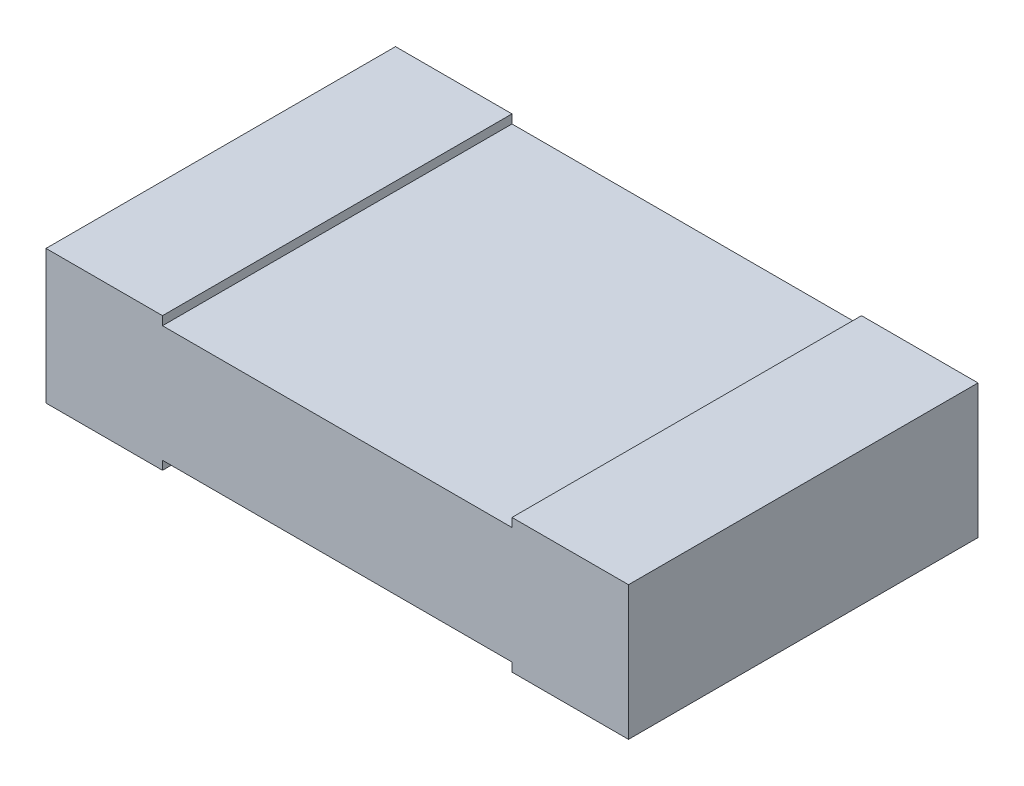
ISO-10303-21;
HEADER;
FILE_DESCRIPTION(('STEP AP214'),'2;1');
FILE_NAME('part.step','',(''),(''),'','','');
FILE_SCHEMA(('AUTOMOTIVE_DESIGN { 1 0 10303 214 1 1 1 1 }'));
ENDSEC;
DATA;
#1=APPLICATION_CONTEXT('core data for automotive mechanical design processes');
#2=APPLICATION_PROTOCOL_DEFINITION('international standard','automotive_design',2000,#1);
#3=PRODUCT_CONTEXT('',#1,'mechanical');
#4=PRODUCT('Part','Part','',(#3));
#5=PRODUCT_RELATED_PRODUCT_CATEGORY('part','',(#4));
#6=PRODUCT_DEFINITION_FORMATION('','',#4);
#7=PRODUCT_DEFINITION_CONTEXT('part definition',#1,'design');
#8=PRODUCT_DEFINITION('design','',#6,#7);
#9=PRODUCT_DEFINITION_SHAPE('','',#8);
#10=(LENGTH_UNIT() NAMED_UNIT(*) SI_UNIT(.MILLI.,.METRE.));
#11=(NAMED_UNIT(*) PLANE_ANGLE_UNIT() SI_UNIT($,.RADIAN.));
#12=(NAMED_UNIT(*) SI_UNIT($,.STERADIAN.) SOLID_ANGLE_UNIT());
#13=UNCERTAINTY_MEASURE_WITH_UNIT(LENGTH_MEASURE(1.E-05),#10,'distance_accuracy_value','');
#14=(GEOMETRIC_REPRESENTATION_CONTEXT(3) GLOBAL_UNCERTAINTY_ASSIGNED_CONTEXT((#13)) GLOBAL_UNIT_ASSIGNED_CONTEXT((#10,
#11,#12)) REPRESENTATION_CONTEXT('',''));
#15=CARTESIAN_POINT('',(0.,0.,0.));
#16=DIRECTION('',(0.,0.,1.));
#17=DIRECTION('',(1.,0.,0.));
#18=AXIS2_PLACEMENT_3D('',#15,#16,#17);
#19=CARTESIAN_POINT('',(0.,0.4,0.));
#20=DIRECTION('',(0.,1.,0.));
#21=DIRECTION('',(0.,0.,1.));
#22=AXIS2_PLACEMENT_3D('',#19,#20,#21);
#23=PLANE('',#22);
#24=DIRECTION('',(0.,0.,-1.));
#25=VECTOR('',#24,1.);
#26=CARTESIAN_POINT('',(0.6,0.4,0.));
#27=LINE('',#26,#25);
#28=CARTESIAN_POINT('',(0.6,0.4,0.6));
#29=VERTEX_POINT('',#28);
#30=CARTESIAN_POINT('',(0.6,0.4,-0.6));
#31=VERTEX_POINT('',#30);
#32=EDGE_CURVE('E20',#29,#31,#27,.T.);
#33=ORIENTED_EDGE('',*,*,#32,.T.);
#34=DIRECTION('',(-1.,0.,0.));
#35=VECTOR('',#34,1.);
#36=CARTESIAN_POINT('',(0.6,0.4,-0.6));
#37=LINE('',#36,#35);
#38=CARTESIAN_POINT('',(-0.6,0.4,-0.6));
#39=VERTEX_POINT('',#38);
#40=EDGE_CURVE('E123',#39,#31,#37,.F.);
#41=ORIENTED_EDGE('',*,*,#40,.F.);
#42=DIRECTION('',(0.,0.,-1.));
#43=VECTOR('',#42,1.);
#44=CARTESIAN_POINT('',(-0.6,0.4,0.));
#45=LINE('',#44,#43);
#46=CARTESIAN_POINT('',(-0.6,0.4,0.6));
#47=VERTEX_POINT('',#46);
#48=EDGE_CURVE('E122',#47,#39,#45,.T.);
#49=ORIENTED_EDGE('',*,*,#48,.F.);
#50=DIRECTION('',(1.,0.,0.));
#51=VECTOR('',#50,1.);
#52=CARTESIAN_POINT('',(-0.6,0.4,0.6));
#53=LINE('',#52,#51);
#54=EDGE_CURVE('E109',#29,#47,#53,.F.);
#55=ORIENTED_EDGE('',*,*,#54,.F.);
#56=EDGE_LOOP('',(#33,#41,#49,#55));
#57=FACE_BOUND('',#56,.T.);
#58=ADVANCED_FACE('F17',(#57),#23,.T.);
#59=CARTESIAN_POINT('',(0.6,0.,0.));
#60=DIRECTION('',(1.,0.,0.));
#61=DIRECTION('',(0.,0.,-1.));
#62=AXIS2_PLACEMENT_3D('',#59,#60,#61);
#63=PLANE('',#62);
#64=DIRECTION('',(0.,1.,0.));
#65=VECTOR('',#64,1.);
#66=CARTESIAN_POINT('',(0.6,0.,0.6));
#67=LINE('',#66,#65);
#68=CARTESIAN_POINT('',(0.6,0.43,0.6));
#69=VERTEX_POINT('',#68);
#70=EDGE_CURVE('E117',#69,#29,#67,.F.);
#71=ORIENTED_EDGE('',*,*,#70,.F.);
#72=DIRECTION('',(0.,0.,-1.));
#73=VECTOR('',#72,1.);
#74=CARTESIAN_POINT('',(0.6,0.43,-0.6));
#75=LINE('',#74,#73);
#76=CARTESIAN_POINT('',(0.6,0.43,-0.6));
#77=VERTEX_POINT('',#76);
#78=EDGE_CURVE('E147',#69,#77,#75,.T.);
#79=ORIENTED_EDGE('',*,*,#78,.T.);
#80=DIRECTION('',(0.,1.,0.));
#81=VECTOR('',#80,1.);
#82=CARTESIAN_POINT('',(0.6,0.,-0.6));
#83=LINE('',#82,#81);
#84=EDGE_CURVE('E150',#31,#77,#83,.T.);
#85=ORIENTED_EDGE('',*,*,#84,.F.);
#86=ORIENTED_EDGE('',*,*,#32,.F.);
#87=EDGE_LOOP('',(#71,#79,#85,#86));
#88=FACE_BOUND('',#87,.T.);
#89=ADVANCED_FACE('F151',(#88),#63,.F.);
#90=CARTESIAN_POINT('',(1.,0.43,-0.6));
#91=DIRECTION('',(0.,-1.,0.));
#92=DIRECTION('',(0.,0.,-1.));
#93=AXIS2_PLACEMENT_3D('',#90,#91,#92);
#94=PLANE('',#93);
#95=DIRECTION('',(1.,0.,0.));
#96=VECTOR('',#95,1.);
#97=CARTESIAN_POINT('',(-0.6,0.43,0.6));
#98=LINE('',#97,#96);
#99=CARTESIAN_POINT('',(1.,0.43,0.6));
#100=VERTEX_POINT('',#99);
#101=EDGE_CURVE('E167',#100,#69,#98,.F.);
#102=ORIENTED_EDGE('',*,*,#101,.F.);
#103=DIRECTION('',(0.,0.,-1.));
#104=VECTOR('',#103,1.);
#105=CARTESIAN_POINT('',(1.,0.43,0.));
#106=LINE('',#105,#104);
#107=CARTESIAN_POINT('',(1.,0.43,-0.6));
#108=VERTEX_POINT('',#107);
#109=EDGE_CURVE('E146',#108,#100,#106,.F.);
#110=ORIENTED_EDGE('',*,*,#109,.F.);
#111=DIRECTION('',(-1.,0.,0.));
#112=VECTOR('',#111,1.);
#113=CARTESIAN_POINT('',(0.6,0.43,-0.6));
#114=LINE('',#113,#112);
#115=EDGE_CURVE('E153',#77,#108,#114,.F.);
#116=ORIENTED_EDGE('',*,*,#115,.F.);
#117=ORIENTED_EDGE('',*,*,#78,.F.);
#118=EDGE_LOOP('',(#102,#110,#116,#117));
#119=FACE_BOUND('',#118,.T.);
#120=ADVANCED_FACE('F232',(#119),#94,.F.);
#121=CARTESIAN_POINT('',(1.,0.,0.));
#122=DIRECTION('',(1.,0.,0.));
#123=DIRECTION('',(0.,0.,-1.));
#124=AXIS2_PLACEMENT_3D('',#121,#122,#123);
#125=PLANE('',#124);
#126=DIRECTION('',(0.,1.,0.));
#127=VECTOR('',#126,1.);
#128=CARTESIAN_POINT('',(1.,0.,0.6));
#129=LINE('',#128,#127);
#130=CARTESIAN_POINT('',(1.,-0.0300000000000001,0.6));
#131=VERTEX_POINT('',#130);
#132=EDGE_CURVE('E169',#131,#100,#129,.T.);
#133=ORIENTED_EDGE('',*,*,#132,.F.);
#134=DIRECTION('',(0.,0.,1.));
#135=VECTOR('',#134,1.);
#136=CARTESIAN_POINT('',(1.,-0.03,-0.6));
#137=LINE('',#136,#135);
#138=CARTESIAN_POINT('',(1.,-0.03,-0.6));
#139=VERTEX_POINT('',#138);
#140=EDGE_CURVE('E143',#131,#139,#137,.F.);
#141=ORIENTED_EDGE('',*,*,#140,.T.);
#142=DIRECTION('',(0.,1.,0.));
#143=VECTOR('',#142,1.);
#144=CARTESIAN_POINT('',(1.,0.,-0.6));
#145=LINE('',#144,#143);
#146=EDGE_CURVE('E155',#108,#139,#145,.F.);
#147=ORIENTED_EDGE('',*,*,#146,.F.);
#148=ORIENTED_EDGE('',*,*,#109,.T.);
#149=EDGE_LOOP('',(#133,#141,#147,#148));
#150=FACE_BOUND('',#149,.T.);
#151=ADVANCED_FACE('F215',(#150),#125,.T.);
#152=CARTESIAN_POINT('',(1.,-0.03,-0.6));
#153=DIRECTION('',(0.,1.,0.));
#154=DIRECTION('',(0.,0.,1.));
#155=AXIS2_PLACEMENT_3D('',#152,#153,#154);
#156=PLANE('',#155);
#157=DIRECTION('',(-1.,0.,0.));
#158=VECTOR('',#157,1.);
#159=CARTESIAN_POINT('',(0.6,-0.03,-0.6));
#160=LINE('',#159,#158);
#161=CARTESIAN_POINT('',(0.6,-0.03,-0.6));
#162=VERTEX_POINT('',#161);
#163=EDGE_CURVE('E208',#139,#162,#160,.T.);
#164=ORIENTED_EDGE('',*,*,#163,.F.);
#165=ORIENTED_EDGE('',*,*,#140,.F.);
#166=DIRECTION('',(1.,0.,0.));
#167=VECTOR('',#166,1.);
#168=CARTESIAN_POINT('',(-0.6,-0.03,0.6));
#169=LINE('',#168,#167);
#170=CARTESIAN_POINT('',(0.6,-0.0300000000000001,0.6));
#171=VERTEX_POINT('',#170);
#172=EDGE_CURVE('E172',#171,#131,#169,.T.);
#173=ORIENTED_EDGE('',*,*,#172,.F.);
#174=DIRECTION('',(0.,0.,-1.));
#175=VECTOR('',#174,1.);
#176=CARTESIAN_POINT('',(0.6,-0.03,0.));
#177=LINE('',#176,#175);
#178=EDGE_CURVE('E163',#171,#162,#177,.T.);
#179=ORIENTED_EDGE('',*,*,#178,.T.);
#180=EDGE_LOOP('',(#164,#165,#173,#179));
#181=FACE_BOUND('',#180,.T.);
#182=ADVANCED_FACE('F218',(#181),#156,.F.);
#183=CARTESIAN_POINT('',(-1.,0.,0.));
#184=DIRECTION('',(1.,0.,0.));
#185=DIRECTION('',(0.,0.,-1.));
#186=AXIS2_PLACEMENT_3D('',#183,#184,#185);
#187=PLANE('',#186);
#188=DIRECTION('',(0.,0.,1.));
#189=VECTOR('',#188,1.);
#190=CARTESIAN_POINT('',(-1.,-0.03,-0.6));
#191=LINE('',#190,#189);
#192=CARTESIAN_POINT('',(-1.,-0.03,-0.6));
#193=VERTEX_POINT('',#192);
#194=CARTESIAN_POINT('',(-1.,-0.03,0.6));
#195=VERTEX_POINT('',#194);
#196=EDGE_CURVE('E119',#193,#195,#191,.T.);
#197=ORIENTED_EDGE('',*,*,#196,.T.);
#198=DIRECTION('',(0.,1.,0.));
#199=VECTOR('',#198,1.);
#200=CARTESIAN_POINT('',(-1.,0.,0.6));
#201=LINE('',#200,#199);
#202=CARTESIAN_POINT('',(-1.,0.43,0.6));
#203=VERTEX_POINT('',#202);
#204=EDGE_CURVE('E134',#203,#195,#201,.F.);
#205=ORIENTED_EDGE('',*,*,#204,.F.);
#206=DIRECTION('',(0.,0.,-1.));
#207=VECTOR('',#206,1.);
#208=CARTESIAN_POINT('',(-1.,0.43,-0.6));
#209=LINE('',#208,#207);
#210=CARTESIAN_POINT('',(-1.,0.43,-0.6));
#211=VERTEX_POINT('',#210);
#212=EDGE_CURVE('E128',#203,#211,#209,.T.);
#213=ORIENTED_EDGE('',*,*,#212,.T.);
#214=DIRECTION('',(0.,1.,0.));
#215=VECTOR('',#214,1.);
#216=CARTESIAN_POINT('',(-1.,0.,-0.6));
#217=LINE('',#216,#215);
#218=EDGE_CURVE('E183',#193,#211,#217,.T.);
#219=ORIENTED_EDGE('',*,*,#218,.F.);
#220=EDGE_LOOP('',(#197,#205,#213,#219));
#221=FACE_BOUND('',#220,.T.);
#222=ADVANCED_FACE('F182',(#221),#187,.F.);
#223=CARTESIAN_POINT('',(-1.,0.43,-0.6));
#224=DIRECTION('',(0.,-1.,0.));
#225=DIRECTION('',(0.,0.,-1.));
#226=AXIS2_PLACEMENT_3D('',#223,#224,#225);
#227=PLANE('',#226);
#228=DIRECTION('',(-1.,0.,0.));
#229=VECTOR('',#228,1.);
#230=CARTESIAN_POINT('',(0.6,0.43,-0.6));
#231=LINE('',#230,#229);
#232=CARTESIAN_POINT('',(-0.6,0.43,-0.6));
#233=VERTEX_POINT('',#232);
#234=EDGE_CURVE('E202',#211,#233,#231,.F.);
#235=ORIENTED_EDGE('',*,*,#234,.F.);
#236=ORIENTED_EDGE('',*,*,#212,.F.);
#237=DIRECTION('',(1.,0.,0.));
#238=VECTOR('',#237,1.);
#239=CARTESIAN_POINT('',(-0.6,0.43,0.6));
#240=LINE('',#239,#238);
#241=CARTESIAN_POINT('',(-0.6,0.43,0.6));
#242=VERTEX_POINT('',#241);
#243=EDGE_CURVE('E132',#242,#203,#240,.F.);
#244=ORIENTED_EDGE('',*,*,#243,.F.);
#245=DIRECTION('',(0.,0.,-1.));
#246=VECTOR('',#245,1.);
#247=CARTESIAN_POINT('',(-0.6,0.43,0.));
#248=LINE('',#247,#246);
#249=EDGE_CURVE('E127',#233,#242,#248,.F.);
#250=ORIENTED_EDGE('',*,*,#249,.F.);
#251=EDGE_LOOP('',(#235,#236,#244,#250));
#252=FACE_BOUND('',#251,.T.);
#253=ADVANCED_FACE('F258',(#252),#227,.F.);
#254=CARTESIAN_POINT('',(-0.6,0.,0.));
#255=DIRECTION('',(1.,0.,0.));
#256=DIRECTION('',(0.,0.,-1.));
#257=AXIS2_PLACEMENT_3D('',#254,#255,#256);
#258=PLANE('',#257);
#259=ORIENTED_EDGE('',*,*,#249,.T.);
#260=DIRECTION('',(0.,1.,0.));
#261=VECTOR('',#260,1.);
#262=CARTESIAN_POINT('',(-0.6,0.,0.6));
#263=LINE('',#262,#261);
#264=EDGE_CURVE('E115',#47,#242,#263,.T.);
#265=ORIENTED_EDGE('',*,*,#264,.F.);
#266=ORIENTED_EDGE('',*,*,#48,.T.);
#267=DIRECTION('',(0.,1.,0.));
#268=VECTOR('',#267,1.);
#269=CARTESIAN_POINT('',(-0.6,0.,-0.6));
#270=LINE('',#269,#268);
#271=EDGE_CURVE('E200',#233,#39,#270,.F.);
#272=ORIENTED_EDGE('',*,*,#271,.F.);
#273=EDGE_LOOP('',(#259,#265,#266,#272));
#274=FACE_BOUND('',#273,.T.);
#275=ADVANCED_FACE('F130',(#274),#258,.T.);
#276=CARTESIAN_POINT('',(-1.,-0.03,-0.6));
#277=DIRECTION('',(0.,1.,0.));
#278=DIRECTION('',(0.,0.,1.));
#279=AXIS2_PLACEMENT_3D('',#276,#277,#278);
#280=PLANE('',#279);
#281=DIRECTION('',(1.,0.,0.));
#282=VECTOR('',#281,1.);
#283=CARTESIAN_POINT('',(-0.6,-0.03,0.6));
#284=LINE('',#283,#282);
#285=CARTESIAN_POINT('',(-0.6,-0.03,0.6));
#286=VERTEX_POINT('',#285);
#287=EDGE_CURVE('E175',#195,#286,#284,.T.);
#288=ORIENTED_EDGE('',*,*,#287,.F.);
#289=ORIENTED_EDGE('',*,*,#196,.F.);
#290=DIRECTION('',(-1.,0.,0.));
#291=VECTOR('',#290,1.);
#292=CARTESIAN_POINT('',(0.6,-0.03,-0.6));
#293=LINE('',#292,#291);
#294=CARTESIAN_POINT('',(-0.6,-0.03,-0.6));
#295=VERTEX_POINT('',#294);
#296=EDGE_CURVE('E189',#295,#193,#293,.T.);
#297=ORIENTED_EDGE('',*,*,#296,.F.);
#298=DIRECTION('',(0.,0.,-1.));
#299=VECTOR('',#298,1.);
#300=CARTESIAN_POINT('',(-0.6,-0.03,0.));
#301=LINE('',#300,#299);
#302=EDGE_CURVE('E188',#286,#295,#301,.T.);
#303=ORIENTED_EDGE('',*,*,#302,.F.);
#304=EDGE_LOOP('',(#288,#289,#297,#303));
#305=FACE_BOUND('',#304,.T.);
#306=ADVANCED_FACE('F187',(#305),#280,.F.);
#307=CARTESIAN_POINT('',(-0.6,0.,0.6));
#308=DIRECTION('',(0.,0.,1.));
#309=DIRECTION('',(1.,0.,0.));
#310=AXIS2_PLACEMENT_3D('',#307,#308,#309);
#311=PLANE('',#310);
#312=ORIENTED_EDGE('',*,*,#101,.T.);
#313=ORIENTED_EDGE('',*,*,#70,.T.);
#314=ORIENTED_EDGE('',*,*,#54,.T.);
#315=ORIENTED_EDGE('',*,*,#264,.T.);
#316=ORIENTED_EDGE('',*,*,#243,.T.);
#317=ORIENTED_EDGE('',*,*,#204,.T.);
#318=ORIENTED_EDGE('',*,*,#287,.T.);
#319=DIRECTION('',(0.,1.,0.));
#320=VECTOR('',#319,1.);
#321=CARTESIAN_POINT('',(-0.6,0.,0.6));
#322=LINE('',#321,#320);
#323=CARTESIAN_POINT('',(-0.6,0.,0.6));
#324=VERTEX_POINT('',#323);
#325=EDGE_CURVE('E191',#324,#286,#322,.F.);
#326=ORIENTED_EDGE('',*,*,#325,.F.);
#327=DIRECTION('',(1.,0.,0.));
#328=VECTOR('',#327,1.);
#329=CARTESIAN_POINT('',(0.,0.,0.6));
#330=LINE('',#329,#328);
#331=CARTESIAN_POINT('',(0.6,0.,0.6));
#332=VERTEX_POINT('',#331);
#333=EDGE_CURVE('E190',#324,#332,#330,.T.);
#334=ORIENTED_EDGE('',*,*,#333,.T.);
#335=DIRECTION('',(0.,1.,0.));
#336=VECTOR('',#335,1.);
#337=CARTESIAN_POINT('',(0.6,0.,0.6));
#338=LINE('',#337,#336);
#339=EDGE_CURVE('E157',#332,#171,#338,.F.);
#340=ORIENTED_EDGE('',*,*,#339,.T.);
#341=ORIENTED_EDGE('',*,*,#172,.T.);
#342=ORIENTED_EDGE('',*,*,#132,.T.);
#343=EDGE_LOOP('',(#312,#313,#314,#315,#316,#317,#318,#326,#334,#340,#341,#342));
#344=FACE_BOUND('',#343,.T.);
#345=ADVANCED_FACE('F112',(#344),#311,.T.);
#346=CARTESIAN_POINT('',(0.6,0.,0.));
#347=DIRECTION('',(1.,0.,0.));
#348=DIRECTION('',(0.,0.,-1.));
#349=AXIS2_PLACEMENT_3D('',#346,#347,#348);
#350=PLANE('',#349);
#351=DIRECTION('',(0.,0.,1.));
#352=VECTOR('',#351,1.);
#353=CARTESIAN_POINT('',(0.6,0.,0.));
#354=LINE('',#353,#352);
#355=CARTESIAN_POINT('',(0.6,0.,-0.6));
#356=VERTEX_POINT('',#355);
#357=EDGE_CURVE('E194',#332,#356,#354,.F.);
#358=ORIENTED_EDGE('',*,*,#357,.T.);
#359=DIRECTION('',(0.,1.,0.));
#360=VECTOR('',#359,1.);
#361=CARTESIAN_POINT('',(0.6,0.,-0.6));
#362=LINE('',#361,#360);
#363=EDGE_CURVE('E206',#162,#356,#362,.T.);
#364=ORIENTED_EDGE('',*,*,#363,.F.);
#365=ORIENTED_EDGE('',*,*,#178,.F.);
#366=ORIENTED_EDGE('',*,*,#339,.F.);
#367=EDGE_LOOP('',(#358,#364,#365,#366));
#368=FACE_BOUND('',#367,.T.);
#369=ADVANCED_FACE('F222',(#368),#350,.F.);
#370=CARTESIAN_POINT('',(0.6,0.,-0.6));
#371=DIRECTION('',(0.,0.,-1.));
#372=DIRECTION('',(-1.,0.,0.));
#373=AXIS2_PLACEMENT_3D('',#370,#371,#372);
#374=PLANE('',#373);
#375=ORIENTED_EDGE('',*,*,#234,.T.);
#376=ORIENTED_EDGE('',*,*,#271,.T.);
#377=ORIENTED_EDGE('',*,*,#40,.T.);
#378=ORIENTED_EDGE('',*,*,#84,.T.);
#379=ORIENTED_EDGE('',*,*,#115,.T.);
#380=ORIENTED_EDGE('',*,*,#146,.T.);
#381=ORIENTED_EDGE('',*,*,#163,.T.);
#382=ORIENTED_EDGE('',*,*,#363,.T.);
#383=DIRECTION('',(1.,0.,0.));
#384=VECTOR('',#383,1.);
#385=CARTESIAN_POINT('',(0.,0.,-0.6));
#386=LINE('',#385,#384);
#387=CARTESIAN_POINT('',(-0.6,0.,-0.6));
#388=VERTEX_POINT('',#387);
#389=EDGE_CURVE('E26',#356,#388,#386,.F.);
#390=ORIENTED_EDGE('',*,*,#389,.T.);
#391=DIRECTION('',(0.,1.,0.));
#392=VECTOR('',#391,1.);
#393=CARTESIAN_POINT('',(-0.6,0.,-0.6));
#394=LINE('',#393,#392);
#395=EDGE_CURVE('E34',#295,#388,#394,.T.);
#396=ORIENTED_EDGE('',*,*,#395,.F.);
#397=ORIENTED_EDGE('',*,*,#296,.T.);
#398=ORIENTED_EDGE('',*,*,#218,.T.);
#399=EDGE_LOOP('',(#375,#376,#377,#378,#379,#380,#381,#382,#390,#396,#397,#398));
#400=FACE_BOUND('',#399,.T.);
#401=ADVANCED_FACE('F210',(#400),#374,.T.);
#402=CARTESIAN_POINT('',(-0.6,0.,0.));
#403=DIRECTION('',(1.,0.,0.));
#404=DIRECTION('',(0.,0.,-1.));
#405=AXIS2_PLACEMENT_3D('',#402,#403,#404);
#406=PLANE('',#405);
#407=ORIENTED_EDGE('',*,*,#325,.T.);
#408=ORIENTED_EDGE('',*,*,#302,.T.);
#409=ORIENTED_EDGE('',*,*,#395,.T.);
#410=DIRECTION('',(0.,0.,1.));
#411=VECTOR('',#410,1.);
#412=CARTESIAN_POINT('',(-0.6,0.,0.));
#413=LINE('',#412,#411);
#414=EDGE_CURVE('E11',#388,#324,#413,.T.);
#415=ORIENTED_EDGE('',*,*,#414,.T.);
#416=EDGE_LOOP('',(#407,#408,#409,#415));
#417=FACE_BOUND('',#416,.T.);
#418=ADVANCED_FACE('F229',(#417),#406,.T.);
#419=CARTESIAN_POINT('',(0.,0.,0.));
#420=DIRECTION('',(0.,1.,0.));
#421=DIRECTION('',(0.,0.,1.));
#422=AXIS2_PLACEMENT_3D('',#419,#420,#421);
#423=PLANE('',#422);
#424=ORIENTED_EDGE('',*,*,#389,.F.);
#425=ORIENTED_EDGE('',*,*,#357,.F.);
#426=ORIENTED_EDGE('',*,*,#333,.F.);
#427=ORIENTED_EDGE('',*,*,#414,.F.);
#428=EDGE_LOOP('',(#424,#425,#426,#427));
#429=FACE_BOUND('',#428,.T.);
#430=ADVANCED_FACE('F227',(#429),#423,.F.);
#431=CLOSED_SHELL('',(#58,#89,#120,#151,#182,#222,#253,#275,#306,#345,#369,#401,#418,#430));
#432=MANIFOLD_SOLID_BREP('B1',#431);
#433=ADVANCED_BREP_SHAPE_REPRESENTATION('',(#18,#432),#14);
#434=SHAPE_DEFINITION_REPRESENTATION(#9,#433);
ENDSEC;
END-ISO-10303-21;
